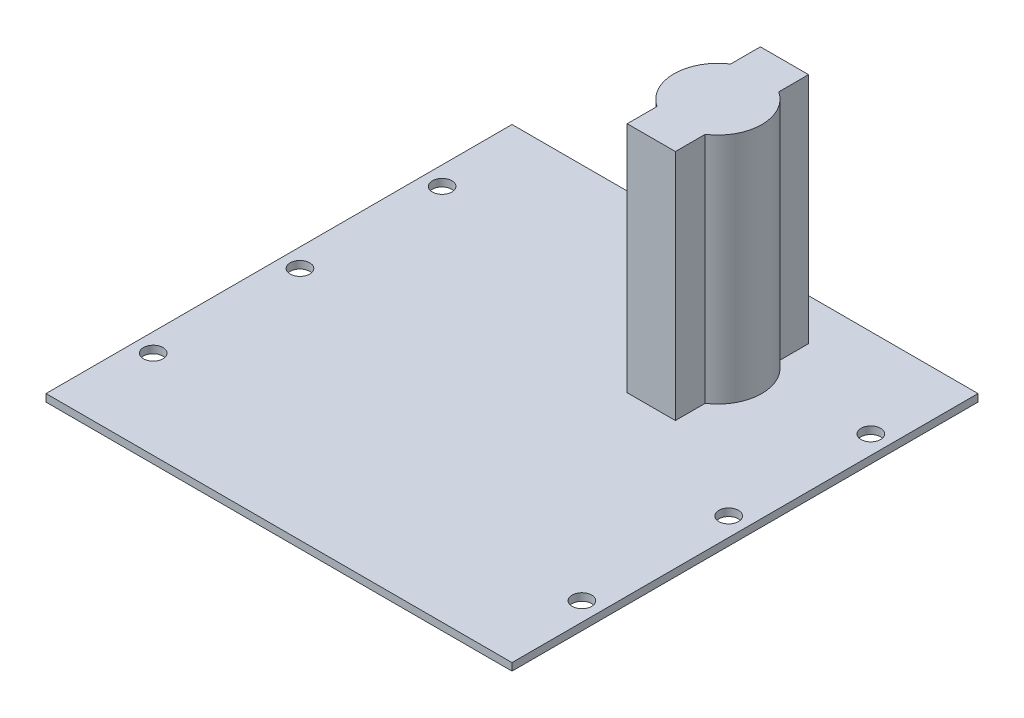
ISO-10303-21;
HEADER;
FILE_DESCRIPTION(('STEP AP214'),'2;1');
FILE_NAME('part.step','',(''),(''),'','','');
FILE_SCHEMA(('AUTOMOTIVE_DESIGN { 1 0 10303 214 1 1 1 1 }'));
ENDSEC;
DATA;
#1=APPLICATION_CONTEXT('core data for automotive mechanical design processes');
#2=APPLICATION_PROTOCOL_DEFINITION('international standard','automotive_design',2000,#1);
#3=PRODUCT_CONTEXT('',#1,'mechanical');
#4=PRODUCT('Part','Part','',(#3));
#5=PRODUCT_RELATED_PRODUCT_CATEGORY('part','',(#4));
#6=PRODUCT_DEFINITION_FORMATION('','',#4);
#7=PRODUCT_DEFINITION_CONTEXT('part definition',#1,'design');
#8=PRODUCT_DEFINITION('design','',#6,#7);
#9=PRODUCT_DEFINITION_SHAPE('','',#8);
#10=(LENGTH_UNIT() NAMED_UNIT(*) SI_UNIT(.MILLI.,.METRE.));
#11=(NAMED_UNIT(*) PLANE_ANGLE_UNIT() SI_UNIT($,.RADIAN.));
#12=(NAMED_UNIT(*) SI_UNIT($,.STERADIAN.) SOLID_ANGLE_UNIT());
#13=UNCERTAINTY_MEASURE_WITH_UNIT(LENGTH_MEASURE(1.E-05),#10,'distance_accuracy_value','');
#14=(GEOMETRIC_REPRESENTATION_CONTEXT(3) GLOBAL_UNCERTAINTY_ASSIGNED_CONTEXT((#13)) GLOBAL_UNIT_ASSIGNED_CONTEXT((#10,
#11,#12)) REPRESENTATION_CONTEXT('',''));
#15=CARTESIAN_POINT('',(0.,0.,0.));
#16=DIRECTION('',(0.,0.,1.));
#17=DIRECTION('',(1.,0.,0.));
#18=AXIS2_PLACEMENT_3D('',#15,#16,#17);
#19=CARTESIAN_POINT('',(0.,1.6,0.));
#20=DIRECTION('',(0.,-1.,0.));
#21=DIRECTION('',(0.,0.,-1.));
#22=AXIS2_PLACEMENT_3D('',#19,#20,#21);
#23=PLANE('',#22);
#24=CARTESIAN_POINT('',(46.,1.6,-31.));
#25=DIRECTION('',(0.,1.,0.));
#26=DIRECTION('',(0.,0.,-1.));
#27=AXIS2_PLACEMENT_3D('',#24,#25,#26);
#28=CIRCLE('',#27,2.1);
#29=CARTESIAN_POINT('',(46.,1.6,-33.1));
#30=VERTEX_POINT('',#29);
#31=EDGE_CURVE('E161',#30,#30,#28,.T.);
#32=ORIENTED_EDGE('',*,*,#31,.F.);
#33=EDGE_LOOP('',(#32));
#34=FACE_BOUND('',#33,.T.);
#35=CARTESIAN_POINT('',(46.,1.6,-0.500000000000004));
#36=DIRECTION('',(0.,1.,0.));
#37=DIRECTION('',(0.,0.,-1.));
#38=AXIS2_PLACEMENT_3D('',#35,#36,#37);
#39=CIRCLE('',#38,2.1);
#40=CARTESIAN_POINT('',(46.,1.6,-2.6));
#41=VERTEX_POINT('',#40);
#42=EDGE_CURVE('E171',#41,#41,#39,.T.);
#43=ORIENTED_EDGE('',*,*,#42,.F.);
#44=EDGE_LOOP('',(#43));
#45=FACE_BOUND('',#44,.T.);
#46=CARTESIAN_POINT('',(46.,1.6,31.));
#47=DIRECTION('',(0.,1.,0.));
#48=DIRECTION('',(0.,0.,-1.));
#49=AXIS2_PLACEMENT_3D('',#46,#47,#48);
#50=CIRCLE('',#49,2.1);
#51=CARTESIAN_POINT('',(46.,1.6,28.9));
#52=VERTEX_POINT('',#51);
#53=EDGE_CURVE('E179',#52,#52,#50,.T.);
#54=ORIENTED_EDGE('',*,*,#53,.F.);
#55=EDGE_LOOP('',(#54));
#56=FACE_BOUND('',#55,.T.);
#57=CARTESIAN_POINT('',(-46.,1.6,31.));
#58=DIRECTION('',(0.,1.,0.));
#59=DIRECTION('',(0.,0.,1.));
#60=AXIS2_PLACEMENT_3D('',#57,#58,#59);
#61=CIRCLE('',#60,2.1);
#62=CARTESIAN_POINT('',(-46.,1.6,33.1));
#63=VERTEX_POINT('',#62);
#64=EDGE_CURVE('E187',#63,#63,#61,.T.);
#65=ORIENTED_EDGE('',*,*,#64,.F.);
#66=EDGE_LOOP('',(#65));
#67=FACE_BOUND('',#66,.T.);
#68=CARTESIAN_POINT('',(-46.,1.6,-0.500000000000004));
#69=DIRECTION('',(0.,1.,0.));
#70=DIRECTION('',(0.,0.,1.));
#71=AXIS2_PLACEMENT_3D('',#68,#69,#70);
#72=CIRCLE('',#71,2.1);
#73=CARTESIAN_POINT('',(-46.,1.6,1.59999999999999));
#74=VERTEX_POINT('',#73);
#75=EDGE_CURVE('E195',#74,#74,#72,.T.);
#76=ORIENTED_EDGE('',*,*,#75,.F.);
#77=EDGE_LOOP('',(#76));
#78=FACE_BOUND('',#77,.T.);
#79=CARTESIAN_POINT('',(-46.,1.6,-31.));
#80=DIRECTION('',(0.,1.,0.));
#81=DIRECTION('',(0.,0.,1.));
#82=AXIS2_PLACEMENT_3D('',#79,#80,#81);
#83=CIRCLE('',#82,2.1);
#84=CARTESIAN_POINT('',(-46.,1.6,-28.9));
#85=VERTEX_POINT('',#84);
#86=EDGE_CURVE('E203',#85,#85,#83,.T.);
#87=ORIENTED_EDGE('',*,*,#86,.F.);
#88=EDGE_LOOP('',(#87));
#89=FACE_BOUND('',#88,.T.);
#90=DIRECTION('',(0.,0.,-1.));
#91=VECTOR('',#90,1.);
#92=CARTESIAN_POINT('',(50.,1.6,50.));
#93=LINE('',#92,#91);
#94=CARTESIAN_POINT('',(50.,1.6,50.));
#95=VERTEX_POINT('',#94);
#96=CARTESIAN_POINT('',(50.,1.6,-50.));
#97=VERTEX_POINT('',#96);
#98=EDGE_CURVE('E211',#95,#97,#93,.T.);
#99=ORIENTED_EDGE('',*,*,#98,.T.);
#100=DIRECTION('',(-1.,0.,0.));
#101=VECTOR('',#100,1.);
#102=CARTESIAN_POINT('',(-50.,1.6,-50.));
#103=LINE('',#102,#101);
#104=CARTESIAN_POINT('',(-50.,1.6,-50.));
#105=VERTEX_POINT('',#104);
#106=EDGE_CURVE('E215',#97,#105,#103,.T.);
#107=ORIENTED_EDGE('',*,*,#106,.T.);
#108=DIRECTION('',(0.,0.,1.));
#109=VECTOR('',#108,1.);
#110=CARTESIAN_POINT('',(-50.,1.6,50.));
#111=LINE('',#110,#109);
#112=CARTESIAN_POINT('',(-50.,1.6,50.));
#113=VERTEX_POINT('',#112);
#114=EDGE_CURVE('E219',#105,#113,#111,.T.);
#115=ORIENTED_EDGE('',*,*,#114,.T.);
#116=DIRECTION('',(1.,0.,0.));
#117=VECTOR('',#116,1.);
#118=CARTESIAN_POINT('',(-50.,1.6,50.));
#119=LINE('',#118,#117);
#120=EDGE_CURVE('E222',#113,#95,#119,.T.);
#121=ORIENTED_EDGE('',*,*,#120,.T.);
#122=EDGE_LOOP('',(#99,#107,#115,#121));
#123=FACE_BOUND('',#122,.T.);
#124=CARTESIAN_POINT('',(17.3856816402136,1.6,-26.7960175235089));
#125=DIRECTION('',(0.,1.,0.));
#126=DIRECTION('',(0.,0.,1.));
#127=AXIS2_PLACEMENT_3D('',#124,#125,#126);
#128=CIRCLE('',#127,9.43452453350108);
#129=CARTESIAN_POINT('',(12.217414708795,1.6,-34.6890061906007));
#130=VERTEX_POINT('',#129);
#131=CARTESIAN_POINT('',(12.217414708795,1.6,-18.9030288564172));
#132=VERTEX_POINT('',#131);
#133=EDGE_CURVE('E154',#130,#132,#128,.T.);
#134=ORIENTED_EDGE('',*,*,#133,.F.);
#135=DIRECTION('',(0.,0.,1.));
#136=VECTOR('',#135,1.);
#137=CARTESIAN_POINT('',(12.217414708795,1.6,0.));
#138=LINE('',#137,#136);
#139=CARTESIAN_POINT('',(12.217414708795,1.6,-41.0844893449962));
#140=VERTEX_POINT('',#139);
#141=EDGE_CURVE('E151',#140,#130,#138,.T.);
#142=ORIENTED_EDGE('',*,*,#141,.F.);
#143=DIRECTION('',(1.,0.,0.));
#144=VECTOR('',#143,1.);
#145=CARTESIAN_POINT('',(0.,1.6,-41.0844893449962));
#146=LINE('',#145,#144);
#147=CARTESIAN_POINT('',(22.5539485716322,1.6,-41.0844893449962));
#148=VERTEX_POINT('',#147);
#149=EDGE_CURVE('E481',#140,#148,#146,.T.);
#150=ORIENTED_EDGE('',*,*,#149,.T.);
#151=DIRECTION('',(0.,0.,1.));
#152=VECTOR('',#151,1.);
#153=CARTESIAN_POINT('',(22.5539485716322,1.6,0.));
#154=LINE('',#153,#152);
#155=CARTESIAN_POINT('',(22.5539485716322,1.6,-34.6890061906007));
#156=VERTEX_POINT('',#155);
#157=EDGE_CURVE('E523',#148,#156,#154,.T.);
#158=ORIENTED_EDGE('',*,*,#157,.T.);
#159=CARTESIAN_POINT('',(17.3856816402136,1.6,-26.7960175235089));
#160=DIRECTION('',(0.,1.,0.));
#161=DIRECTION('',(0.,0.,1.));
#162=AXIS2_PLACEMENT_3D('',#159,#160,#161);
#163=CIRCLE('',#162,9.43452453350108);
#164=CARTESIAN_POINT('',(22.5539485716322,1.6,-18.9030288564171));
#165=VERTEX_POINT('',#164);
#166=EDGE_CURVE('E515',#165,#156,#163,.T.);
#167=ORIENTED_EDGE('',*,*,#166,.F.);
#168=DIRECTION('',(0.,0.,1.));
#169=VECTOR('',#168,1.);
#170=CARTESIAN_POINT('',(22.5539485716322,1.6,0.));
#171=LINE('',#170,#169);
#172=CARTESIAN_POINT('',(22.5539485716322,1.6,-12.5075457020216));
#173=VERTEX_POINT('',#172);
#174=EDGE_CURVE('E508',#165,#173,#171,.T.);
#175=ORIENTED_EDGE('',*,*,#174,.T.);
#176=DIRECTION('',(1.,0.,0.));
#177=VECTOR('',#176,1.);
#178=CARTESIAN_POINT('',(0.,1.6,-12.5075457020216));
#179=LINE('',#178,#177);
#180=CARTESIAN_POINT('',(12.217414708795,1.6,-12.5075457020216));
#181=VERTEX_POINT('',#180);
#182=EDGE_CURVE('E62',#181,#173,#179,.T.);
#183=ORIENTED_EDGE('',*,*,#182,.F.);
#184=DIRECTION('',(0.,0.,1.));
#185=VECTOR('',#184,1.);
#186=CARTESIAN_POINT('',(12.217414708795,1.6,0.));
#187=LINE('',#186,#185);
#188=EDGE_CURVE('E57',#132,#181,#187,.T.);
#189=ORIENTED_EDGE('',*,*,#188,.F.);
#190=EDGE_LOOP('',(#134,#142,#150,#158,#167,#175,#183,#189));
#191=FACE_BOUND('',#190,.T.);
#192=ADVANCED_FACE('F41',(#34,#45,#56,#67,#78,#89,#123,#191),#23,.F.);
#193=CARTESIAN_POINT('',(0.,0.,0.));
#194=DIRECTION('',(0.,-1.,0.));
#195=DIRECTION('',(0.,0.,-1.));
#196=AXIS2_PLACEMENT_3D('',#193,#194,#195);
#197=PLANE('',#196);
#198=CARTESIAN_POINT('',(46.,0.,-0.500000000000004));
#199=DIRECTION('',(0.,1.,0.));
#200=DIRECTION('',(0.,0.,-1.));
#201=AXIS2_PLACEMENT_3D('',#198,#199,#200);
#202=CIRCLE('',#201,2.1);
#203=CARTESIAN_POINT('',(46.,0.,-2.6));
#204=VERTEX_POINT('',#203);
#205=EDGE_CURVE('E169',#204,#204,#202,.T.);
#206=ORIENTED_EDGE('',*,*,#205,.T.);
#207=EDGE_LOOP('',(#206));
#208=FACE_BOUND('',#207,.T.);
#209=CARTESIAN_POINT('',(-46.,0.,31.));
#210=DIRECTION('',(0.,1.,0.));
#211=DIRECTION('',(0.,0.,1.));
#212=AXIS2_PLACEMENT_3D('',#209,#210,#211);
#213=CIRCLE('',#212,2.1);
#214=CARTESIAN_POINT('',(-46.,0.,33.1));
#215=VERTEX_POINT('',#214);
#216=EDGE_CURVE('E183',#215,#215,#213,.T.);
#217=ORIENTED_EDGE('',*,*,#216,.T.);
#218=EDGE_LOOP('',(#217));
#219=FACE_BOUND('',#218,.T.);
#220=CARTESIAN_POINT('',(-46.,0.,-31.));
#221=DIRECTION('',(0.,1.,0.));
#222=DIRECTION('',(0.,0.,1.));
#223=AXIS2_PLACEMENT_3D('',#220,#221,#222);
#224=CIRCLE('',#223,2.1);
#225=CARTESIAN_POINT('',(-46.,0.,-28.9));
#226=VERTEX_POINT('',#225);
#227=EDGE_CURVE('E199',#226,#226,#224,.T.);
#228=ORIENTED_EDGE('',*,*,#227,.T.);
#229=EDGE_LOOP('',(#228));
#230=FACE_BOUND('',#229,.T.);
#231=DIRECTION('',(0.,0.,-1.));
#232=VECTOR('',#231,1.);
#233=CARTESIAN_POINT('',(50.,0.,50.));
#234=LINE('',#233,#232);
#235=CARTESIAN_POINT('',(50.,0.,50.));
#236=VERTEX_POINT('',#235);
#237=CARTESIAN_POINT('',(50.,0.,-50.));
#238=VERTEX_POINT('',#237);
#239=EDGE_CURVE('E207',#236,#238,#234,.T.);
#240=ORIENTED_EDGE('',*,*,#239,.F.);
#241=DIRECTION('',(1.,0.,0.));
#242=VECTOR('',#241,1.);
#243=CARTESIAN_POINT('',(-50.,0.,50.));
#244=LINE('',#243,#242);
#245=CARTESIAN_POINT('',(-50.,0.,50.));
#246=VERTEX_POINT('',#245);
#247=EDGE_CURVE('E216',#246,#236,#244,.T.);
#248=ORIENTED_EDGE('',*,*,#247,.F.);
#249=DIRECTION('',(0.,0.,1.));
#250=VECTOR('',#249,1.);
#251=CARTESIAN_POINT('',(-50.,0.,50.));
#252=LINE('',#251,#250);
#253=CARTESIAN_POINT('',(-50.,0.,-50.));
#254=VERTEX_POINT('',#253);
#255=EDGE_CURVE('E232',#254,#246,#252,.T.);
#256=ORIENTED_EDGE('',*,*,#255,.F.);
#257=DIRECTION('',(-1.,0.,0.));
#258=VECTOR('',#257,1.);
#259=CARTESIAN_POINT('',(-50.,0.,-50.));
#260=LINE('',#259,#258);
#261=EDGE_CURVE('E229',#238,#254,#260,.T.);
#262=ORIENTED_EDGE('',*,*,#261,.F.);
#263=EDGE_LOOP('',(#240,#248,#256,#262));
#264=FACE_BOUND('',#263,.T.);
#265=CARTESIAN_POINT('',(-46.,0.,-0.500000000000004));
#266=DIRECTION('',(0.,1.,0.));
#267=DIRECTION('',(0.,0.,1.));
#268=AXIS2_PLACEMENT_3D('',#265,#266,#267);
#269=CIRCLE('',#268,2.1);
#270=CARTESIAN_POINT('',(-46.,0.,1.59999999999999));
#271=VERTEX_POINT('',#270);
#272=EDGE_CURVE('E191',#271,#271,#269,.T.);
#273=ORIENTED_EDGE('',*,*,#272,.T.);
#274=EDGE_LOOP('',(#273));
#275=FACE_BOUND('',#274,.T.);
#276=CARTESIAN_POINT('',(46.,0.,31.));
#277=DIRECTION('',(0.,1.,0.));
#278=DIRECTION('',(0.,0.,-1.));
#279=AXIS2_PLACEMENT_3D('',#276,#277,#278);
#280=CIRCLE('',#279,2.1);
#281=CARTESIAN_POINT('',(46.,0.,28.9));
#282=VERTEX_POINT('',#281);
#283=EDGE_CURVE('E175',#282,#282,#280,.T.);
#284=ORIENTED_EDGE('',*,*,#283,.T.);
#285=EDGE_LOOP('',(#284));
#286=FACE_BOUND('',#285,.T.);
#287=CARTESIAN_POINT('',(46.,0.,-31.));
#288=DIRECTION('',(0.,1.,0.));
#289=DIRECTION('',(0.,0.,-1.));
#290=AXIS2_PLACEMENT_3D('',#287,#288,#289);
#291=CIRCLE('',#290,2.1);
#292=CARTESIAN_POINT('',(46.,0.,-33.1));
#293=VERTEX_POINT('',#292);
#294=EDGE_CURVE('E156',#293,#293,#291,.T.);
#295=ORIENTED_EDGE('',*,*,#294,.T.);
#296=EDGE_LOOP('',(#295));
#297=FACE_BOUND('',#296,.T.);
#298=ADVANCED_FACE('F255',(#208,#219,#230,#264,#275,#286,#297),#197,.T.);
#299=CARTESIAN_POINT('',(50.,1.6,50.));
#300=DIRECTION('',(-1.,0.,0.));
#301=DIRECTION('',(0.,0.,1.));
#302=AXIS2_PLACEMENT_3D('',#299,#300,#301);
#303=PLANE('',#302);
#304=ORIENTED_EDGE('',*,*,#239,.T.);
#305=DIRECTION('',(0.,-1.,0.));
#306=VECTOR('',#305,1.);
#307=CARTESIAN_POINT('',(50.,1.6,-50.));
#308=LINE('',#307,#306);
#309=EDGE_CURVE('E11',#97,#238,#308,.T.);
#310=ORIENTED_EDGE('',*,*,#309,.F.);
#311=ORIENTED_EDGE('',*,*,#98,.F.);
#312=DIRECTION('',(0.,-1.,0.));
#313=VECTOR('',#312,1.);
#314=CARTESIAN_POINT('',(50.,1.6,50.));
#315=LINE('',#314,#313);
#316=EDGE_CURVE('E225',#95,#236,#315,.T.);
#317=ORIENTED_EDGE('',*,*,#316,.T.);
#318=EDGE_LOOP('',(#304,#310,#311,#317));
#319=FACE_BOUND('',#318,.T.);
#320=ADVANCED_FACE('F43',(#319),#303,.F.);
#321=CARTESIAN_POINT('',(-50.,1.6,-50.));
#322=DIRECTION('',(0.,0.,1.));
#323=DIRECTION('',(1.,0.,0.));
#324=AXIS2_PLACEMENT_3D('',#321,#322,#323);
#325=PLANE('',#324);
#326=ORIENTED_EDGE('',*,*,#261,.T.);
#327=DIRECTION('',(0.,-1.,0.));
#328=VECTOR('',#327,1.);
#329=CARTESIAN_POINT('',(-50.,1.6,-50.));
#330=LINE('',#329,#328);
#331=EDGE_CURVE('E50',#105,#254,#330,.T.);
#332=ORIENTED_EDGE('',*,*,#331,.F.);
#333=ORIENTED_EDGE('',*,*,#106,.F.);
#334=ORIENTED_EDGE('',*,*,#309,.T.);
#335=EDGE_LOOP('',(#326,#332,#333,#334));
#336=FACE_BOUND('',#335,.T.);
#337=ADVANCED_FACE('F265',(#336),#325,.F.);
#338=CARTESIAN_POINT('',(-50.,1.6,50.));
#339=DIRECTION('',(1.,0.,0.));
#340=DIRECTION('',(0.,0.,-1.));
#341=AXIS2_PLACEMENT_3D('',#338,#339,#340);
#342=PLANE('',#341);
#343=ORIENTED_EDGE('',*,*,#255,.T.);
#344=DIRECTION('',(0.,-1.,0.));
#345=VECTOR('',#344,1.);
#346=CARTESIAN_POINT('',(-50.,1.6,50.));
#347=LINE('',#346,#345);
#348=EDGE_CURVE('E240',#113,#246,#347,.T.);
#349=ORIENTED_EDGE('',*,*,#348,.F.);
#350=ORIENTED_EDGE('',*,*,#114,.F.);
#351=ORIENTED_EDGE('',*,*,#331,.T.);
#352=EDGE_LOOP('',(#343,#349,#350,#351));
#353=FACE_BOUND('',#352,.T.);
#354=ADVANCED_FACE('F249',(#353),#342,.F.);
#355=CARTESIAN_POINT('',(-50.,1.6,50.));
#356=DIRECTION('',(0.,0.,-1.));
#357=DIRECTION('',(-1.,0.,0.));
#358=AXIS2_PLACEMENT_3D('',#355,#356,#357);
#359=PLANE('',#358);
#360=ORIENTED_EDGE('',*,*,#247,.T.);
#361=ORIENTED_EDGE('',*,*,#316,.F.);
#362=ORIENTED_EDGE('',*,*,#120,.F.);
#363=ORIENTED_EDGE('',*,*,#348,.T.);
#364=EDGE_LOOP('',(#360,#361,#362,#363));
#365=FACE_BOUND('',#364,.T.);
#366=ADVANCED_FACE('F259',(#365),#359,.F.);
#367=CARTESIAN_POINT('',(-46.,1.6,-31.));
#368=DIRECTION('',(0.,-1.,0.));
#369=DIRECTION('',(0.,0.,-1.));
#370=AXIS2_PLACEMENT_3D('',#367,#368,#369);
#371=CYLINDRICAL_SURFACE('',#370,2.1);
#372=ORIENTED_EDGE('',*,*,#86,.T.);
#373=EDGE_LOOP('',(#372));
#374=FACE_BOUND('',#373,.T.);
#375=ORIENTED_EDGE('',*,*,#227,.F.);
#376=EDGE_LOOP('',(#375));
#377=FACE_BOUND('',#376,.T.);
#378=ADVANCED_FACE('F283',(#374,#377),#371,.F.);
#379=CARTESIAN_POINT('',(-46.,1.6,-0.500000000000004));
#380=DIRECTION('',(0.,-1.,0.));
#381=DIRECTION('',(0.,0.,-1.));
#382=AXIS2_PLACEMENT_3D('',#379,#380,#381);
#383=CYLINDRICAL_SURFACE('',#382,2.1);
#384=ORIENTED_EDGE('',*,*,#75,.T.);
#385=EDGE_LOOP('',(#384));
#386=FACE_BOUND('',#385,.T.);
#387=ORIENTED_EDGE('',*,*,#272,.F.);
#388=EDGE_LOOP('',(#387));
#389=FACE_BOUND('',#388,.T.);
#390=ADVANCED_FACE('F290',(#386,#389),#383,.F.);
#391=CARTESIAN_POINT('',(-46.,1.6,31.));
#392=DIRECTION('',(0.,-1.,0.));
#393=DIRECTION('',(0.,0.,-1.));
#394=AXIS2_PLACEMENT_3D('',#391,#392,#393);
#395=CYLINDRICAL_SURFACE('',#394,2.1);
#396=ORIENTED_EDGE('',*,*,#64,.T.);
#397=EDGE_LOOP('',(#396));
#398=FACE_BOUND('',#397,.T.);
#399=ORIENTED_EDGE('',*,*,#216,.F.);
#400=EDGE_LOOP('',(#399));
#401=FACE_BOUND('',#400,.T.);
#402=ADVANCED_FACE('F295',(#398,#401),#395,.F.);
#403=CARTESIAN_POINT('',(46.,1.6,31.));
#404=DIRECTION('',(0.,-1.,0.));
#405=DIRECTION('',(0.,0.,-1.));
#406=AXIS2_PLACEMENT_3D('',#403,#404,#405);
#407=CYLINDRICAL_SURFACE('',#406,2.1);
#408=ORIENTED_EDGE('',*,*,#53,.T.);
#409=EDGE_LOOP('',(#408));
#410=FACE_BOUND('',#409,.T.);
#411=ORIENTED_EDGE('',*,*,#283,.F.);
#412=EDGE_LOOP('',(#411));
#413=FACE_BOUND('',#412,.T.);
#414=ADVANCED_FACE('F305',(#410,#413),#407,.F.);
#415=CARTESIAN_POINT('',(46.,1.6,-0.500000000000004));
#416=DIRECTION('',(0.,-1.,0.));
#417=DIRECTION('',(0.,0.,-1.));
#418=AXIS2_PLACEMENT_3D('',#415,#416,#417);
#419=CYLINDRICAL_SURFACE('',#418,2.1);
#420=ORIENTED_EDGE('',*,*,#42,.T.);
#421=EDGE_LOOP('',(#420));
#422=FACE_BOUND('',#421,.T.);
#423=ORIENTED_EDGE('',*,*,#205,.F.);
#424=EDGE_LOOP('',(#423));
#425=FACE_BOUND('',#424,.T.);
#426=ADVANCED_FACE('F312',(#422,#425),#419,.F.);
#427=CARTESIAN_POINT('',(46.,1.6,-31.));
#428=DIRECTION('',(0.,-1.,0.));
#429=DIRECTION('',(0.,0.,-1.));
#430=AXIS2_PLACEMENT_3D('',#427,#428,#429);
#431=CYLINDRICAL_SURFACE('',#430,2.1);
#432=ORIENTED_EDGE('',*,*,#31,.T.);
#433=EDGE_LOOP('',(#432));
#434=FACE_BOUND('',#433,.T.);
#435=ORIENTED_EDGE('',*,*,#294,.F.);
#436=EDGE_LOOP('',(#435));
#437=FACE_BOUND('',#436,.T.);
#438=ADVANCED_FACE('F316',(#434,#437),#431,.F.);
#439=CARTESIAN_POINT('',(17.3856816402136,51.6,-26.7960175235089));
#440=DIRECTION('',(0.,-1.,0.));
#441=DIRECTION('',(0.,0.,-1.));
#442=AXIS2_PLACEMENT_3D('',#439,#440,#441);
#443=CYLINDRICAL_SURFACE('',#442,9.43452453350108);
#444=ORIENTED_EDGE('',*,*,#133,.T.);
#445=DIRECTION('',(0.,-1.,0.));
#446=VECTOR('',#445,1.);
#447=CARTESIAN_POINT('',(12.217414708795,51.6,-18.9030288564172));
#448=LINE('',#447,#446);
#449=CARTESIAN_POINT('',(12.217414708795,51.6,-18.9030288564172));
#450=VERTEX_POINT('',#449);
#451=EDGE_CURVE('E132',#450,#132,#448,.T.);
#452=ORIENTED_EDGE('',*,*,#451,.F.);
#453=CARTESIAN_POINT('',(17.3856816402136,51.6,-26.7960175235089));
#454=DIRECTION('',(0.,1.,0.));
#455=DIRECTION('',(0.,0.,1.));
#456=AXIS2_PLACEMENT_3D('',#453,#454,#455);
#457=CIRCLE('',#456,9.43452453350108);
#458=CARTESIAN_POINT('',(12.217414708795,51.6,-34.6890061906007));
#459=VERTEX_POINT('',#458);
#460=EDGE_CURVE('E140',#459,#450,#457,.T.);
#461=ORIENTED_EDGE('',*,*,#460,.F.);
#462=DIRECTION('',(0.,-1.,0.));
#463=VECTOR('',#462,1.);
#464=CARTESIAN_POINT('',(12.217414708795,51.6,-34.6890061906007));
#465=LINE('',#464,#463);
#466=EDGE_CURVE('E477',#459,#130,#465,.T.);
#467=ORIENTED_EDGE('',*,*,#466,.T.);
#468=EDGE_LOOP('',(#444,#452,#461,#467));
#469=FACE_BOUND('',#468,.T.);
#470=ADVANCED_FACE('F153',(#469),#443,.T.);
#471=CARTESIAN_POINT('',(12.217414708795,51.6,0.));
#472=DIRECTION('',(1.,0.,0.));
#473=DIRECTION('',(0.,0.,-1.));
#474=AXIS2_PLACEMENT_3D('',#471,#472,#473);
#475=PLANE('',#474);
#476=ORIENTED_EDGE('',*,*,#188,.T.);
#477=DIRECTION('',(0.,-1.,0.));
#478=VECTOR('',#477,1.);
#479=CARTESIAN_POINT('',(12.217414708795,51.6,-12.5075457020216));
#480=LINE('',#479,#478);
#481=CARTESIAN_POINT('',(12.217414708795,51.6,-12.5075457020216));
#482=VERTEX_POINT('',#481);
#483=EDGE_CURVE('E135',#482,#181,#480,.T.);
#484=ORIENTED_EDGE('',*,*,#483,.F.);
#485=DIRECTION('',(0.,0.,1.));
#486=VECTOR('',#485,1.);
#487=CARTESIAN_POINT('',(12.217414708795,51.6,0.));
#488=LINE('',#487,#486);
#489=EDGE_CURVE('E128',#450,#482,#488,.T.);
#490=ORIENTED_EDGE('',*,*,#489,.F.);
#491=ORIENTED_EDGE('',*,*,#451,.T.);
#492=EDGE_LOOP('',(#476,#484,#490,#491));
#493=FACE_BOUND('',#492,.T.);
#494=ADVANCED_FACE('F130',(#493),#475,.F.);
#495=CARTESIAN_POINT('',(0.,51.6,-12.5075457020216));
#496=DIRECTION('',(0.,0.,-1.));
#497=DIRECTION('',(-1.,0.,0.));
#498=AXIS2_PLACEMENT_3D('',#495,#496,#497);
#499=PLANE('',#498);
#500=ORIENTED_EDGE('',*,*,#182,.T.);
#501=DIRECTION('',(0.,-1.,0.));
#502=VECTOR('',#501,1.);
#503=CARTESIAN_POINT('',(22.5539485716322,51.6,-12.5075457020216));
#504=LINE('',#503,#502);
#505=CARTESIAN_POINT('',(22.5539485716322,51.6,-12.5075457020216));
#506=VERTEX_POINT('',#505);
#507=EDGE_CURVE('E163',#506,#173,#504,.T.);
#508=ORIENTED_EDGE('',*,*,#507,.F.);
#509=DIRECTION('',(1.,0.,0.));
#510=VECTOR('',#509,1.);
#511=CARTESIAN_POINT('',(0.,51.6,-12.5075457020216));
#512=LINE('',#511,#510);
#513=EDGE_CURVE('E139',#482,#506,#512,.T.);
#514=ORIENTED_EDGE('',*,*,#513,.F.);
#515=ORIENTED_EDGE('',*,*,#483,.T.);
#516=EDGE_LOOP('',(#500,#508,#514,#515));
#517=FACE_BOUND('',#516,.T.);
#518=ADVANCED_FACE('F325',(#517),#499,.F.);
#519=CARTESIAN_POINT('',(22.5539485716322,51.6,0.));
#520=DIRECTION('',(1.,0.,0.));
#521=DIRECTION('',(0.,0.,-1.));
#522=AXIS2_PLACEMENT_3D('',#519,#520,#521);
#523=PLANE('',#522);
#524=ORIENTED_EDGE('',*,*,#174,.F.);
#525=DIRECTION('',(0.,-1.,0.));
#526=VECTOR('',#525,1.);
#527=CARTESIAN_POINT('',(22.5539485716322,51.6,-18.9030288564172));
#528=LINE('',#527,#526);
#529=CARTESIAN_POINT('',(22.5539485716322,51.6,-18.9030288564172));
#530=VERTEX_POINT('',#529);
#531=EDGE_CURVE('E500',#530,#165,#528,.T.);
#532=ORIENTED_EDGE('',*,*,#531,.F.);
#533=DIRECTION('',(0.,0.,1.));
#534=VECTOR('',#533,1.);
#535=CARTESIAN_POINT('',(22.5539485716322,51.6,0.));
#536=LINE('',#535,#534);
#537=EDGE_CURVE('E510',#530,#506,#536,.T.);
#538=ORIENTED_EDGE('',*,*,#537,.T.);
#539=ORIENTED_EDGE('',*,*,#507,.T.);
#540=EDGE_LOOP('',(#524,#532,#538,#539));
#541=FACE_BOUND('',#540,.T.);
#542=ADVANCED_FACE('F328',(#541),#523,.T.);
#543=CARTESIAN_POINT('',(17.3856816402136,51.6,-26.7960175235089));
#544=DIRECTION('',(0.,-1.,0.));
#545=DIRECTION('',(0.,0.,-1.));
#546=AXIS2_PLACEMENT_3D('',#543,#544,#545);
#547=CYLINDRICAL_SURFACE('',#546,9.43452453350108);
#548=ORIENTED_EDGE('',*,*,#166,.T.);
#549=DIRECTION('',(0.,-1.,0.));
#550=VECTOR('',#549,1.);
#551=CARTESIAN_POINT('',(22.5539485716322,51.6,-34.6890061906007));
#552=LINE('',#551,#550);
#553=CARTESIAN_POINT('',(22.5539485716322,51.6,-34.6890061906007));
#554=VERTEX_POINT('',#553);
#555=EDGE_CURVE('E496',#554,#156,#552,.T.);
#556=ORIENTED_EDGE('',*,*,#555,.F.);
#557=CARTESIAN_POINT('',(17.3856816402136,51.6,-26.7960175235089));
#558=DIRECTION('',(0.,1.,0.));
#559=DIRECTION('',(0.,0.,1.));
#560=AXIS2_PLACEMENT_3D('',#557,#558,#559);
#561=CIRCLE('',#560,9.43452453350108);
#562=EDGE_CURVE('E533',#530,#554,#561,.T.);
#563=ORIENTED_EDGE('',*,*,#562,.F.);
#564=ORIENTED_EDGE('',*,*,#531,.T.);
#565=EDGE_LOOP('',(#548,#556,#563,#564));
#566=FACE_BOUND('',#565,.T.);
#567=ADVANCED_FACE('F332',(#566),#547,.T.);
#568=CARTESIAN_POINT('',(22.5539485716322,51.6,0.));
#569=DIRECTION('',(1.,0.,0.));
#570=DIRECTION('',(0.,0.,-1.));
#571=AXIS2_PLACEMENT_3D('',#568,#569,#570);
#572=PLANE('',#571);
#573=ORIENTED_EDGE('',*,*,#157,.F.);
#574=DIRECTION('',(0.,-1.,0.));
#575=VECTOR('',#574,1.);
#576=CARTESIAN_POINT('',(22.5539485716322,51.6,-41.0844893449962));
#577=LINE('',#576,#575);
#578=CARTESIAN_POINT('',(22.5539485716322,51.6,-41.0844893449962));
#579=VERTEX_POINT('',#578);
#580=EDGE_CURVE('E487',#579,#148,#577,.T.);
#581=ORIENTED_EDGE('',*,*,#580,.F.);
#582=DIRECTION('',(0.,0.,1.));
#583=VECTOR('',#582,1.);
#584=CARTESIAN_POINT('',(22.5539485716322,51.6,0.));
#585=LINE('',#584,#583);
#586=EDGE_CURVE('E531',#579,#554,#585,.T.);
#587=ORIENTED_EDGE('',*,*,#586,.T.);
#588=ORIENTED_EDGE('',*,*,#555,.T.);
#589=EDGE_LOOP('',(#573,#581,#587,#588));
#590=FACE_BOUND('',#589,.T.);
#591=ADVANCED_FACE('F336',(#590),#572,.T.);
#592=CARTESIAN_POINT('',(0.,51.6,-41.0844893449962));
#593=DIRECTION('',(0.,0.,-1.));
#594=DIRECTION('',(-1.,0.,0.));
#595=AXIS2_PLACEMENT_3D('',#592,#593,#594);
#596=PLANE('',#595);
#597=ORIENTED_EDGE('',*,*,#149,.F.);
#598=DIRECTION('',(0.,-1.,0.));
#599=VECTOR('',#598,1.);
#600=CARTESIAN_POINT('',(12.217414708795,51.6,-41.0844893449962));
#601=LINE('',#600,#599);
#602=CARTESIAN_POINT('',(12.217414708795,51.6,-41.0844893449962));
#603=VERTEX_POINT('',#602);
#604=EDGE_CURVE('E478',#603,#140,#601,.T.);
#605=ORIENTED_EDGE('',*,*,#604,.F.);
#606=DIRECTION('',(1.,0.,0.));
#607=VECTOR('',#606,1.);
#608=CARTESIAN_POINT('',(0.,51.6,-41.0844893449962));
#609=LINE('',#608,#607);
#610=EDGE_CURVE('E489',#603,#579,#609,.T.);
#611=ORIENTED_EDGE('',*,*,#610,.T.);
#612=ORIENTED_EDGE('',*,*,#580,.T.);
#613=EDGE_LOOP('',(#597,#605,#611,#612));
#614=FACE_BOUND('',#613,.T.);
#615=ADVANCED_FACE('F340',(#614),#596,.T.);
#616=CARTESIAN_POINT('',(12.217414708795,51.6,0.));
#617=DIRECTION('',(1.,0.,0.));
#618=DIRECTION('',(0.,0.,-1.));
#619=AXIS2_PLACEMENT_3D('',#616,#617,#618);
#620=PLANE('',#619);
#621=ORIENTED_EDGE('',*,*,#141,.T.);
#622=ORIENTED_EDGE('',*,*,#466,.F.);
#623=DIRECTION('',(0.,0.,1.));
#624=VECTOR('',#623,1.);
#625=CARTESIAN_POINT('',(12.217414708795,51.6,0.));
#626=LINE('',#625,#624);
#627=EDGE_CURVE('E146',#603,#459,#626,.T.);
#628=ORIENTED_EDGE('',*,*,#627,.F.);
#629=ORIENTED_EDGE('',*,*,#604,.T.);
#630=EDGE_LOOP('',(#621,#622,#628,#629));
#631=FACE_BOUND('',#630,.T.);
#632=ADVANCED_FACE('F344',(#631),#620,.F.);
#633=CARTESIAN_POINT('',(0.,51.6,0.));
#634=DIRECTION('',(0.,1.,0.));
#635=DIRECTION('',(0.,0.,1.));
#636=AXIS2_PLACEMENT_3D('',#633,#634,#635);
#637=PLANE('',#636);
#638=ORIENTED_EDGE('',*,*,#460,.T.);
#639=ORIENTED_EDGE('',*,*,#489,.T.);
#640=ORIENTED_EDGE('',*,*,#513,.T.);
#641=ORIENTED_EDGE('',*,*,#537,.F.);
#642=ORIENTED_EDGE('',*,*,#562,.T.);
#643=ORIENTED_EDGE('',*,*,#586,.F.);
#644=ORIENTED_EDGE('',*,*,#610,.F.);
#645=ORIENTED_EDGE('',*,*,#627,.T.);
#646=EDGE_LOOP('',(#638,#639,#640,#641,#642,#643,#644,#645));
#647=FACE_BOUND('',#646,.T.);
#648=ADVANCED_FACE('F143',(#647),#637,.T.);
#649=CLOSED_SHELL('',(#192,#298,#320,#337,#354,#366,#378,#390,#402,#414,#426,#438,#470,#494,
#518,#542,#567,#591,#615,#632,#648));
#650=MANIFOLD_SOLID_BREP('B2',#649);
#651=ADVANCED_BREP_SHAPE_REPRESENTATION('',(#18,#650),#14);
#652=SHAPE_DEFINITION_REPRESENTATION(#9,#651);
ENDSEC;
END-ISO-10303-21;
